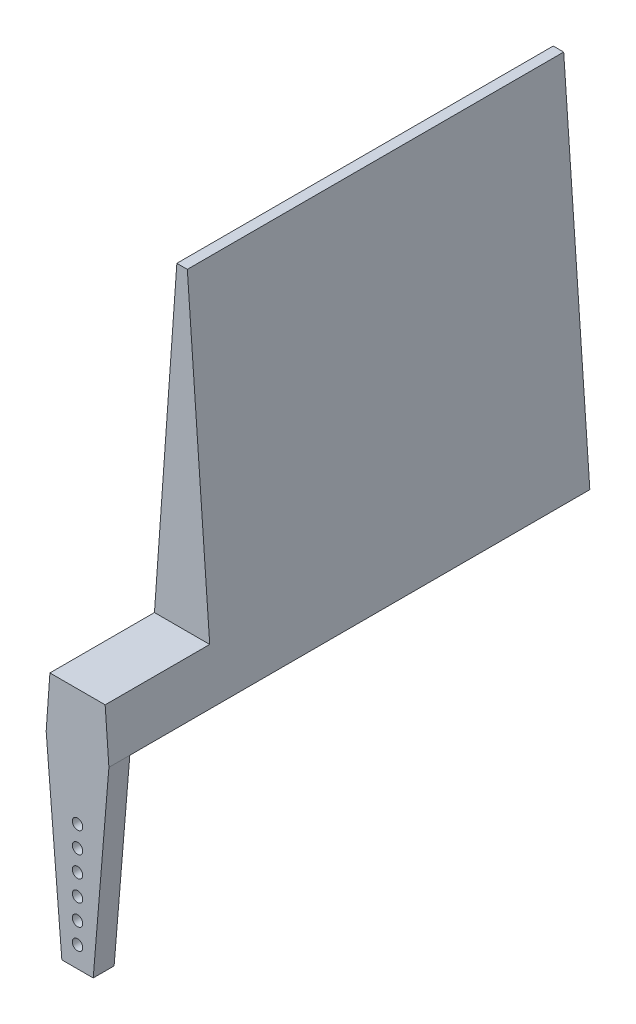
ISO-10303-21;
HEADER;
FILE_DESCRIPTION(('STEP AP214'),'2;1');
FILE_NAME('part.step','',(''),(''),'','','');
FILE_SCHEMA(('AUTOMOTIVE_DESIGN { 1 0 10303 214 1 1 1 1 }'));
ENDSEC;
DATA;
#1=APPLICATION_CONTEXT('core data for automotive mechanical design processes');
#2=APPLICATION_PROTOCOL_DEFINITION('international standard','automotive_design',2000,#1);
#3=PRODUCT_CONTEXT('',#1,'mechanical');
#4=PRODUCT('Part','Part','',(#3));
#5=PRODUCT_RELATED_PRODUCT_CATEGORY('part','',(#4));
#6=PRODUCT_DEFINITION_FORMATION('','',#4);
#7=PRODUCT_DEFINITION_CONTEXT('part definition',#1,'design');
#8=PRODUCT_DEFINITION('design','',#6,#7);
#9=PRODUCT_DEFINITION_SHAPE('','',#8);
#10=(LENGTH_UNIT() NAMED_UNIT(*) SI_UNIT(.MILLI.,.METRE.));
#11=(NAMED_UNIT(*) PLANE_ANGLE_UNIT() SI_UNIT($,.RADIAN.));
#12=(NAMED_UNIT(*) SI_UNIT($,.STERADIAN.) SOLID_ANGLE_UNIT());
#13=UNCERTAINTY_MEASURE_WITH_UNIT(LENGTH_MEASURE(1.E-05),#10,'distance_accuracy_value','');
#14=(GEOMETRIC_REPRESENTATION_CONTEXT(3) GLOBAL_UNCERTAINTY_ASSIGNED_CONTEXT((#13)) GLOBAL_UNIT_ASSIGNED_CONTEXT((#10,
#11,#12)) REPRESENTATION_CONTEXT('',''));
#15=CARTESIAN_POINT('',(0.,0.,0.));
#16=DIRECTION('',(0.,0.,1.));
#17=DIRECTION('',(1.,0.,0.));
#18=AXIS2_PLACEMENT_3D('',#15,#16,#17);
#19=CARTESIAN_POINT('',(60.5722359618717,20.7278633503816,-36.));
#20=DIRECTION('',(0.,-1.,0.));
#21=DIRECTION('',(0.,0.,-1.));
#22=AXIS2_PLACEMENT_3D('',#19,#20,#21);
#23=PLANE('',#22);
#24=DIRECTION('',(0.,0.,1.));
#25=VECTOR('',#24,1.);
#26=CARTESIAN_POINT('',(66.5722359618717,20.7278633503816,-36.));
#27=LINE('',#26,#25);
#28=CARTESIAN_POINT('',(66.5722359618717,20.7278633503816,-36.));
#29=VERTEX_POINT('',#28);
#30=CARTESIAN_POINT('',(66.5722359618717,20.7278633503816,8.));
#31=VERTEX_POINT('',#30);
#32=EDGE_CURVE('E45',#29,#31,#27,.T.);
#33=ORIENTED_EDGE('',*,*,#32,.T.);
#34=DIRECTION('',(-1.,0.,0.));
#35=VECTOR('',#34,1.);
#36=CARTESIAN_POINT('',(66.5722359618717,20.7278633503816,8.));
#37=LINE('',#36,#35);
#38=CARTESIAN_POINT('',(60.5722359618717,20.7278633503816,8.));
#39=VERTEX_POINT('',#38);
#40=EDGE_CURVE('E122',#31,#39,#37,.T.);
#41=ORIENTED_EDGE('',*,*,#40,.T.);
#42=DIRECTION('',(0.,0.,1.));
#43=VECTOR('',#42,1.);
#44=CARTESIAN_POINT('',(60.5722359618717,20.7278633503816,-36.));
#45=LINE('',#44,#43);
#46=CARTESIAN_POINT('',(60.5722359618717,20.7278633503816,-36.));
#47=VERTEX_POINT('',#46);
#48=EDGE_CURVE('E11',#47,#39,#45,.T.);
#49=ORIENTED_EDGE('',*,*,#48,.F.);
#50=DIRECTION('',(1.,0.,0.));
#51=VECTOR('',#50,1.);
#52=CARTESIAN_POINT('',(60.5722359618717,20.7278633503816,-36.));
#53=LINE('',#52,#51);
#54=EDGE_CURVE('E165',#47,#29,#53,.T.);
#55=ORIENTED_EDGE('',*,*,#54,.T.);
#56=EDGE_LOOP('',(#33,#41,#49,#55));
#57=FACE_BOUND('',#56,.T.);
#58=ADVANCED_FACE('F39',(#57),#23,.T.);
#59=CARTESIAN_POINT('',(0.,0.,0.));
#60=DIRECTION('',(0.,0.,-1.));
#61=DIRECTION('',(-1.,0.,0.));
#62=AXIS2_PLACEMENT_3D('',#59,#60,#61);
#63=PLANE('',#62);
#64=DIRECTION('',(-1.,0.,0.));
#65=VECTOR('',#64,1.);
#66=CARTESIAN_POINT('',(60.9293788190146,25.7278633503816,0.));
#67=LINE('',#66,#65);
#68=CARTESIAN_POINT('',(66.2150931047289,25.7278633503816,0.));
#69=VERTEX_POINT('',#68);
#70=CARTESIAN_POINT('',(60.9293788190146,25.7278633503816,0.));
#71=VERTEX_POINT('',#70);
#72=EDGE_CURVE('E64',#69,#71,#67,.T.);
#73=ORIENTED_EDGE('',*,*,#72,.F.);
#74=DIRECTION('',(-0.0712470499879097,0.997458699830735,0.));
#75=VECTOR('',#74,1.);
#76=CARTESIAN_POINT('',(64.0722359618717,55.7278633503816,0.));
#77=LINE('',#76,#75);
#78=CARTESIAN_POINT('',(64.0722359618717,55.7278633503816,0.));
#79=VERTEX_POINT('',#78);
#80=EDGE_CURVE('E161',#69,#79,#77,.T.);
#81=ORIENTED_EDGE('',*,*,#80,.T.);
#82=DIRECTION('',(-1.,0.,0.));
#83=VECTOR('',#82,1.);
#84=CARTESIAN_POINT('',(63.0722359618717,55.7278633503816,0.));
#85=LINE('',#84,#83);
#86=CARTESIAN_POINT('',(63.0722359618717,55.7278633503816,0.));
#87=VERTEX_POINT('',#86);
#88=EDGE_CURVE('E178',#79,#87,#85,.T.);
#89=ORIENTED_EDGE('',*,*,#88,.T.);
#90=DIRECTION('',(-0.0712470499879097,-0.997458699830735,0.));
#91=VECTOR('',#90,1.);
#92=CARTESIAN_POINT('',(63.0722359618717,55.7278633503816,0.));
#93=LINE('',#92,#91);
#94=EDGE_CURVE('E166',#87,#71,#93,.T.);
#95=ORIENTED_EDGE('',*,*,#94,.T.);
#96=EDGE_LOOP('',(#73,#81,#89,#95));
#97=FACE_BOUND('',#96,.T.);
#98=ADVANCED_FACE('F196',(#97),#63,.F.);
#99=CARTESIAN_POINT('',(63.0722359618717,55.7278633503816,-36.));
#100=DIRECTION('',(-0.997458699830735,0.0712470499879097,0.));
#101=DIRECTION('',(-0.0712470499879097,-0.997458699830735,0.));
#102=AXIS2_PLACEMENT_3D('',#99,#100,#101);
#103=PLANE('',#102);
#104=ORIENTED_EDGE('',*,*,#94,.F.);
#105=DIRECTION('',(0.,0.,1.));
#106=VECTOR('',#105,1.);
#107=CARTESIAN_POINT('',(63.0722359618717,55.7278633503816,-36.));
#108=LINE('',#107,#106);
#109=CARTESIAN_POINT('',(63.0722359618717,55.7278633503816,-36.));
#110=VERTEX_POINT('',#109);
#111=EDGE_CURVE('E50',#110,#87,#108,.T.);
#112=ORIENTED_EDGE('',*,*,#111,.F.);
#113=DIRECTION('',(-0.0712470499879097,-0.997458699830735,0.));
#114=VECTOR('',#113,1.);
#115=CARTESIAN_POINT('',(63.0722359618717,55.7278633503816,-36.));
#116=LINE('',#115,#114);
#117=EDGE_CURVE('E172',#110,#47,#116,.T.);
#118=ORIENTED_EDGE('',*,*,#117,.T.);
#119=ORIENTED_EDGE('',*,*,#48,.T.);
#120=DIRECTION('',(0.,0.,1.));
#121=VECTOR('',#120,1.);
#122=CARTESIAN_POINT('',(60.5722359618717,20.7278633503816,8.));
#123=LINE('',#122,#121);
#124=CARTESIAN_POINT('',(60.5722359618717,20.7278633503816,10.));
#125=VERTEX_POINT('',#124);
#126=EDGE_CURVE('E126',#39,#125,#123,.T.);
#127=ORIENTED_EDGE('',*,*,#126,.T.);
#128=DIRECTION('',(-0.0712470499879105,-0.997458699830735,0.));
#129=VECTOR('',#128,1.);
#130=CARTESIAN_POINT('',(60.5722359618717,20.7278633503816,10.));
#131=LINE('',#130,#129);
#132=CARTESIAN_POINT('',(60.9293788190146,25.7278633503816,10.));
#133=VERTEX_POINT('',#132);
#134=EDGE_CURVE('E152',#133,#125,#131,.T.);
#135=ORIENTED_EDGE('',*,*,#134,.F.);
#136=DIRECTION('',(0.,0.,-1.));
#137=VECTOR('',#136,1.);
#138=CARTESIAN_POINT('',(60.9293788190146,25.7278633503816,10.));
#139=LINE('',#138,#137);
#140=EDGE_CURVE('E159',#133,#71,#139,.T.);
#141=ORIENTED_EDGE('',*,*,#140,.T.);
#142=EDGE_LOOP('',(#104,#112,#118,#119,#127,#135,#141));
#143=FACE_BOUND('',#142,.T.);
#144=ADVANCED_FACE('F201',(#143),#103,.T.);
#145=CARTESIAN_POINT('',(63.0722359618717,55.7278633503816,-36.));
#146=DIRECTION('',(0.,1.,0.));
#147=DIRECTION('',(0.,0.,1.));
#148=AXIS2_PLACEMENT_3D('',#145,#146,#147);
#149=PLANE('',#148);
#150=ORIENTED_EDGE('',*,*,#88,.F.);
#151=DIRECTION('',(0.,0.,1.));
#152=VECTOR('',#151,1.);
#153=CARTESIAN_POINT('',(64.0722359618717,55.7278633503816,-36.));
#154=LINE('',#153,#152);
#155=CARTESIAN_POINT('',(64.0722359618717,55.7278633503816,-36.));
#156=VERTEX_POINT('',#155);
#157=EDGE_CURVE('E185',#156,#79,#154,.T.);
#158=ORIENTED_EDGE('',*,*,#157,.F.);
#159=DIRECTION('',(-1.,0.,0.));
#160=VECTOR('',#159,1.);
#161=CARTESIAN_POINT('',(63.0722359618717,55.7278633503816,-36.));
#162=LINE('',#161,#160);
#163=EDGE_CURVE('E171',#156,#110,#162,.T.);
#164=ORIENTED_EDGE('',*,*,#163,.T.);
#165=ORIENTED_EDGE('',*,*,#111,.T.);
#166=EDGE_LOOP('',(#150,#158,#164,#165));
#167=FACE_BOUND('',#166,.T.);
#168=ADVANCED_FACE('F197',(#167),#149,.T.);
#169=CARTESIAN_POINT('',(64.0722359618717,55.7278633503816,-36.));
#170=DIRECTION('',(0.997458699830735,0.0712470499879097,0.));
#171=DIRECTION('',(-0.0712470499879097,0.997458699830735,0.));
#172=AXIS2_PLACEMENT_3D('',#169,#170,#171);
#173=PLANE('',#172);
#174=ORIENTED_EDGE('',*,*,#80,.F.);
#175=DIRECTION('',(0.,0.,-1.));
#176=VECTOR('',#175,1.);
#177=CARTESIAN_POINT('',(66.2150931047289,25.7278633503816,10.));
#178=LINE('',#177,#176);
#179=CARTESIAN_POINT('',(66.2150931047289,25.7278633503816,10.));
#180=VERTEX_POINT('',#179);
#181=EDGE_CURVE('E157',#180,#69,#178,.T.);
#182=ORIENTED_EDGE('',*,*,#181,.F.);
#183=DIRECTION('',(-0.0712470499879105,0.997458699830735,0.));
#184=VECTOR('',#183,1.);
#185=CARTESIAN_POINT('',(66.2150931047289,25.7278633503816,10.));
#186=LINE('',#185,#184);
#187=CARTESIAN_POINT('',(66.5722359618717,20.7278633503816,10.));
#188=VERTEX_POINT('',#187);
#189=EDGE_CURVE('E146',#188,#180,#186,.T.);
#190=ORIENTED_EDGE('',*,*,#189,.F.);
#191=DIRECTION('',(0.,0.,1.));
#192=VECTOR('',#191,1.);
#193=CARTESIAN_POINT('',(66.5722359618717,20.7278633503816,8.));
#194=LINE('',#193,#192);
#195=EDGE_CURVE('E147',#31,#188,#194,.T.);
#196=ORIENTED_EDGE('',*,*,#195,.F.);
#197=ORIENTED_EDGE('',*,*,#32,.F.);
#198=DIRECTION('',(-0.0712470499879097,0.997458699830735,0.));
#199=VECTOR('',#198,1.);
#200=CARTESIAN_POINT('',(64.0722359618717,55.7278633503816,-36.));
#201=LINE('',#200,#199);
#202=EDGE_CURVE('E170',#29,#156,#201,.T.);
#203=ORIENTED_EDGE('',*,*,#202,.T.);
#204=ORIENTED_EDGE('',*,*,#157,.T.);
#205=EDGE_LOOP('',(#174,#182,#190,#196,#197,#203,#204));
#206=FACE_BOUND('',#205,.T.);
#207=ADVANCED_FACE('F192',(#206),#173,.T.);
#208=CARTESIAN_POINT('',(0.,0.,-36.));
#209=DIRECTION('',(0.,0.,-1.));
#210=DIRECTION('',(-1.,0.,0.));
#211=AXIS2_PLACEMENT_3D('',#208,#209,#210);
#212=PLANE('',#211);
#213=ORIENTED_EDGE('',*,*,#54,.F.);
#214=ORIENTED_EDGE('',*,*,#117,.F.);
#215=ORIENTED_EDGE('',*,*,#163,.F.);
#216=ORIENTED_EDGE('',*,*,#202,.F.);
#217=EDGE_LOOP('',(#213,#214,#215,#216));
#218=FACE_BOUND('',#217,.T.);
#219=ADVANCED_FACE('F193',(#218),#212,.T.);
#220=CARTESIAN_POINT('',(60.9293788190146,25.7278633503816,10.));
#221=DIRECTION('',(0.,-1.,0.));
#222=DIRECTION('',(0.,0.,-1.));
#223=AXIS2_PLACEMENT_3D('',#220,#221,#222);
#224=PLANE('',#223);
#225=ORIENTED_EDGE('',*,*,#72,.T.);
#226=ORIENTED_EDGE('',*,*,#140,.F.);
#227=DIRECTION('',(-1.,0.,0.));
#228=VECTOR('',#227,1.);
#229=CARTESIAN_POINT('',(60.9293788190146,25.7278633503816,10.));
#230=LINE('',#229,#228);
#231=EDGE_CURVE('E153',#180,#133,#230,.T.);
#232=ORIENTED_EDGE('',*,*,#231,.F.);
#233=ORIENTED_EDGE('',*,*,#181,.T.);
#234=EDGE_LOOP('',(#225,#226,#232,#233));
#235=FACE_BOUND('',#234,.T.);
#236=ADVANCED_FACE('F210',(#235),#224,.F.);
#237=CARTESIAN_POINT('',(0.,0.,10.));
#238=DIRECTION('',(0.,0.,-1.));
#239=DIRECTION('',(-1.,0.,0.));
#240=AXIS2_PLACEMENT_3D('',#237,#238,#239);
#241=PLANE('',#240);
#242=ORIENTED_EDGE('',*,*,#134,.T.);
#243=DIRECTION('',(0.0821390832087535,-0.996620876266209,0.));
#244=VECTOR('',#243,1.);
#245=CARTESIAN_POINT('',(60.5722359618717,20.7278633503816,10.));
#246=LINE('',#245,#244);
#247=CARTESIAN_POINT('',(62.0722359618717,2.52786335038159,10.));
#248=VERTEX_POINT('',#247);
#249=EDGE_CURVE('E142',#125,#248,#246,.T.);
#250=ORIENTED_EDGE('',*,*,#249,.T.);
#251=DIRECTION('',(1.,0.,0.));
#252=VECTOR('',#251,1.);
#253=CARTESIAN_POINT('',(62.0722359618717,2.52786335038159,10.));
#254=LINE('',#253,#252);
#255=CARTESIAN_POINT('',(65.0722359618717,2.52786335038159,10.));
#256=VERTEX_POINT('',#255);
#257=EDGE_CURVE('E120',#248,#256,#254,.T.);
#258=ORIENTED_EDGE('',*,*,#257,.T.);
#259=DIRECTION('',(0.0821390832087535,0.996620876266209,0.));
#260=VECTOR('',#259,1.);
#261=CARTESIAN_POINT('',(65.0722359618717,2.52786335038159,10.));
#262=LINE('',#261,#260);
#263=EDGE_CURVE('E133',#256,#188,#262,.T.);
#264=ORIENTED_EDGE('',*,*,#263,.T.);
#265=ORIENTED_EDGE('',*,*,#189,.T.);
#266=ORIENTED_EDGE('',*,*,#231,.T.);
#267=EDGE_LOOP('',(#242,#250,#258,#264,#265,#266));
#268=FACE_BOUND('',#267,.T.);
#269=CARTESIAN_POINT('',(63.5722359618717,6.52786335038159,10.));
#270=DIRECTION('',(0.,0.,1.));
#271=DIRECTION('',(-1.,0.,0.));
#272=AXIS2_PLACEMENT_3D('',#269,#270,#271);
#273=CIRCLE('',#272,0.500000000002423);
#274=CARTESIAN_POINT('',(63.0722359618693,6.52786335038159,10.));
#275=VERTEX_POINT('',#274);
#276=EDGE_CURVE('E341',#275,#275,#273,.T.);
#277=ORIENTED_EDGE('',*,*,#276,.F.);
#278=EDGE_LOOP('',(#277));
#279=FACE_BOUND('',#278,.T.);
#280=CARTESIAN_POINT('',(63.5722359618717,4.52786335038159,10.));
#281=DIRECTION('',(0.,0.,1.));
#282=DIRECTION('',(-1.,0.,0.));
#283=AXIS2_PLACEMENT_3D('',#280,#281,#282);
#284=CIRCLE('',#283,0.500000000002423);
#285=CARTESIAN_POINT('',(63.0722359618693,4.52786335038159,10.));
#286=VERTEX_POINT('',#285);
#287=EDGE_CURVE('E348',#286,#286,#284,.T.);
#288=ORIENTED_EDGE('',*,*,#287,.F.);
#289=EDGE_LOOP('',(#288));
#290=FACE_BOUND('',#289,.T.);
#291=CARTESIAN_POINT('',(63.5722359618717,8.52786335038159,10.));
#292=DIRECTION('',(0.,0.,1.));
#293=DIRECTION('',(-1.,0.,0.));
#294=AXIS2_PLACEMENT_3D('',#291,#292,#293);
#295=CIRCLE('',#294,0.500000000002423);
#296=CARTESIAN_POINT('',(63.0722359618693,8.52786335038159,10.));
#297=VERTEX_POINT('',#296);
#298=EDGE_CURVE('E351',#297,#297,#295,.T.);
#299=ORIENTED_EDGE('',*,*,#298,.F.);
#300=EDGE_LOOP('',(#299));
#301=FACE_BOUND('',#300,.T.);
#302=CARTESIAN_POINT('',(63.5722359618717,10.5278633503816,10.));
#303=DIRECTION('',(0.,0.,1.));
#304=DIRECTION('',(-1.,0.,0.));
#305=AXIS2_PLACEMENT_3D('',#302,#303,#304);
#306=CIRCLE('',#305,0.500000000002423);
#307=CARTESIAN_POINT('',(63.0722359618693,10.5278633503816,10.));
#308=VERTEX_POINT('',#307);
#309=EDGE_CURVE('E356',#308,#308,#306,.T.);
#310=ORIENTED_EDGE('',*,*,#309,.F.);
#311=EDGE_LOOP('',(#310));
#312=FACE_BOUND('',#311,.T.);
#313=CARTESIAN_POINT('',(63.5722359618717,12.5278633503816,10.));
#314=DIRECTION('',(0.,0.,1.));
#315=DIRECTION('',(-1.,0.,0.));
#316=AXIS2_PLACEMENT_3D('',#313,#314,#315);
#317=CIRCLE('',#316,0.500000000002423);
#318=CARTESIAN_POINT('',(63.0722359618693,12.5278633503816,10.));
#319=VERTEX_POINT('',#318);
#320=EDGE_CURVE('E364',#319,#319,#317,.T.);
#321=ORIENTED_EDGE('',*,*,#320,.F.);
#322=EDGE_LOOP('',(#321));
#323=FACE_BOUND('',#322,.T.);
#324=CARTESIAN_POINT('',(63.5722359618717,14.5278633503816,10.));
#325=DIRECTION('',(0.,0.,1.));
#326=DIRECTION('',(-1.,0.,0.));
#327=AXIS2_PLACEMENT_3D('',#324,#325,#326);
#328=CIRCLE('',#327,0.500000000002423);
#329=CARTESIAN_POINT('',(63.0722359618693,14.5278633503816,10.));
#330=VERTEX_POINT('',#329);
#331=EDGE_CURVE('E139',#330,#330,#328,.T.);
#332=ORIENTED_EDGE('',*,*,#331,.F.);
#333=EDGE_LOOP('',(#332));
#334=FACE_BOUND('',#333,.T.);
#335=ADVANCED_FACE('F208',(#268,#279,#290,#301,#312,#323,#334),#241,.F.);
#336=CARTESIAN_POINT('',(60.5722359618717,20.7278633503816,8.));
#337=DIRECTION('',(-0.996620876266209,-0.0821390832087535,0.));
#338=DIRECTION('',(0.0821390832087535,-0.996620876266209,0.));
#339=AXIS2_PLACEMENT_3D('',#336,#337,#338);
#340=PLANE('',#339);
#341=ORIENTED_EDGE('',*,*,#249,.F.);
#342=ORIENTED_EDGE('',*,*,#126,.F.);
#343=DIRECTION('',(0.0821390832087535,-0.996620876266209,0.));
#344=VECTOR('',#343,1.);
#345=CARTESIAN_POINT('',(60.5722359618717,20.7278633503816,8.));
#346=LINE('',#345,#344);
#347=CARTESIAN_POINT('',(62.0722359618717,2.52786335038159,8.));
#348=VERTEX_POINT('',#347);
#349=EDGE_CURVE('E54',#39,#348,#346,.T.);
#350=ORIENTED_EDGE('',*,*,#349,.T.);
#351=DIRECTION('',(0.,0.,1.));
#352=VECTOR('',#351,1.);
#353=CARTESIAN_POINT('',(62.0722359618717,2.52786335038159,8.));
#354=LINE('',#353,#352);
#355=EDGE_CURVE('E113',#348,#248,#354,.T.);
#356=ORIENTED_EDGE('',*,*,#355,.T.);
#357=EDGE_LOOP('',(#341,#342,#350,#356));
#358=FACE_BOUND('',#357,.T.);
#359=ADVANCED_FACE('F130',(#358),#340,.T.);
#360=CARTESIAN_POINT('',(65.0722359618717,2.52786335038159,8.));
#361=DIRECTION('',(0.996620876266209,-0.0821390832087535,0.));
#362=DIRECTION('',(0.0821390832087535,0.996620876266209,0.));
#363=AXIS2_PLACEMENT_3D('',#360,#361,#362);
#364=PLANE('',#363);
#365=ORIENTED_EDGE('',*,*,#263,.F.);
#366=DIRECTION('',(0.,0.,1.));
#367=VECTOR('',#366,1.);
#368=CARTESIAN_POINT('',(65.0722359618717,2.52786335038159,8.));
#369=LINE('',#368,#367);
#370=CARTESIAN_POINT('',(65.0722359618717,2.52786335038159,8.));
#371=VERTEX_POINT('',#370);
#372=EDGE_CURVE('E119',#371,#256,#369,.T.);
#373=ORIENTED_EDGE('',*,*,#372,.F.);
#374=DIRECTION('',(0.0821390832087535,0.996620876266209,0.));
#375=VECTOR('',#374,1.);
#376=CARTESIAN_POINT('',(65.0722359618717,2.52786335038159,8.));
#377=LINE('',#376,#375);
#378=EDGE_CURVE('E123',#371,#31,#377,.T.);
#379=ORIENTED_EDGE('',*,*,#378,.T.);
#380=ORIENTED_EDGE('',*,*,#195,.T.);
#381=EDGE_LOOP('',(#365,#373,#379,#380));
#382=FACE_BOUND('',#381,.T.);
#383=ADVANCED_FACE('F211',(#382),#364,.T.);
#384=CARTESIAN_POINT('',(62.0722359618717,2.52786335038159,8.));
#385=DIRECTION('',(0.,-1.,0.));
#386=DIRECTION('',(1.,0.,0.));
#387=AXIS2_PLACEMENT_3D('',#384,#385,#386);
#388=PLANE('',#387);
#389=ORIENTED_EDGE('',*,*,#257,.F.);
#390=ORIENTED_EDGE('',*,*,#355,.F.);
#391=DIRECTION('',(1.,0.,0.));
#392=VECTOR('',#391,1.);
#393=CARTESIAN_POINT('',(62.0722359618717,2.52786335038159,8.));
#394=LINE('',#393,#392);
#395=EDGE_CURVE('E114',#348,#371,#394,.T.);
#396=ORIENTED_EDGE('',*,*,#395,.T.);
#397=ORIENTED_EDGE('',*,*,#372,.T.);
#398=EDGE_LOOP('',(#389,#390,#396,#397));
#399=FACE_BOUND('',#398,.T.);
#400=ADVANCED_FACE('F112',(#399),#388,.T.);
#401=CARTESIAN_POINT('',(0.,0.,8.));
#402=DIRECTION('',(0.,0.,1.));
#403=DIRECTION('',(1.,0.,0.));
#404=AXIS2_PLACEMENT_3D('',#401,#402,#403);
#405=PLANE('',#404);
#406=CARTESIAN_POINT('',(63.5722359618717,6.52786335038159,8.));
#407=DIRECTION('',(0.,0.,1.));
#408=DIRECTION('',(-1.,0.,0.));
#409=AXIS2_PLACEMENT_3D('',#406,#407,#408);
#410=CIRCLE('',#409,0.500000000002423);
#411=CARTESIAN_POINT('',(63.0722359618693,6.52786335038159,8.));
#412=VERTEX_POINT('',#411);
#413=EDGE_CURVE('E342',#412,#412,#410,.T.);
#414=ORIENTED_EDGE('',*,*,#413,.T.);
#415=EDGE_LOOP('',(#414));
#416=FACE_BOUND('',#415,.T.);
#417=CARTESIAN_POINT('',(63.5722359618717,4.52786335038159,8.));
#418=DIRECTION('',(0.,0.,1.));
#419=DIRECTION('',(-1.,0.,0.));
#420=AXIS2_PLACEMENT_3D('',#417,#418,#419);
#421=CIRCLE('',#420,0.500000000002423);
#422=CARTESIAN_POINT('',(63.0722359618693,4.52786335038159,8.));
#423=VERTEX_POINT('',#422);
#424=EDGE_CURVE('E350',#423,#423,#421,.T.);
#425=ORIENTED_EDGE('',*,*,#424,.T.);
#426=EDGE_LOOP('',(#425));
#427=FACE_BOUND('',#426,.T.);
#428=CARTESIAN_POINT('',(63.5722359618717,8.52786335038159,8.));
#429=DIRECTION('',(0.,0.,1.));
#430=DIRECTION('',(-1.,0.,0.));
#431=AXIS2_PLACEMENT_3D('',#428,#429,#430);
#432=CIRCLE('',#431,0.500000000002423);
#433=CARTESIAN_POINT('',(63.0722359618693,8.52786335038159,8.));
#434=VERTEX_POINT('',#433);
#435=EDGE_CURVE('E352',#434,#434,#432,.T.);
#436=ORIENTED_EDGE('',*,*,#435,.T.);
#437=EDGE_LOOP('',(#436));
#438=FACE_BOUND('',#437,.T.);
#439=CARTESIAN_POINT('',(63.5722359618717,10.5278633503816,8.));
#440=DIRECTION('',(0.,0.,1.));
#441=DIRECTION('',(-1.,0.,0.));
#442=AXIS2_PLACEMENT_3D('',#439,#440,#441);
#443=CIRCLE('',#442,0.500000000002423);
#444=CARTESIAN_POINT('',(63.0722359618693,10.5278633503816,8.));
#445=VERTEX_POINT('',#444);
#446=EDGE_CURVE('E363',#445,#445,#443,.T.);
#447=ORIENTED_EDGE('',*,*,#446,.T.);
#448=EDGE_LOOP('',(#447));
#449=FACE_BOUND('',#448,.T.);
#450=CARTESIAN_POINT('',(63.5722359618717,12.5278633503816,8.));
#451=DIRECTION('',(0.,0.,1.));
#452=DIRECTION('',(-1.,0.,0.));
#453=AXIS2_PLACEMENT_3D('',#450,#451,#452);
#454=CIRCLE('',#453,0.500000000002423);
#455=CARTESIAN_POINT('',(63.0722359618693,12.5278633503816,8.));
#456=VERTEX_POINT('',#455);
#457=EDGE_CURVE('E370',#456,#456,#454,.T.);
#458=ORIENTED_EDGE('',*,*,#457,.T.);
#459=EDGE_LOOP('',(#458));
#460=FACE_BOUND('',#459,.T.);
#461=CARTESIAN_POINT('',(63.5722359618717,14.5278633503816,8.));
#462=DIRECTION('',(0.,0.,1.));
#463=DIRECTION('',(-1.,0.,0.));
#464=AXIS2_PLACEMENT_3D('',#461,#462,#463);
#465=CIRCLE('',#464,0.500000000002423);
#466=CARTESIAN_POINT('',(63.0722359618693,14.5278633503816,8.));
#467=VERTEX_POINT('',#466);
#468=EDGE_CURVE('E141',#467,#467,#465,.T.);
#469=ORIENTED_EDGE('',*,*,#468,.T.);
#470=EDGE_LOOP('',(#469));
#471=FACE_BOUND('',#470,.T.);
#472=ORIENTED_EDGE('',*,*,#349,.F.);
#473=ORIENTED_EDGE('',*,*,#40,.F.);
#474=ORIENTED_EDGE('',*,*,#378,.F.);
#475=ORIENTED_EDGE('',*,*,#395,.F.);
#476=EDGE_LOOP('',(#472,#473,#474,#475));
#477=FACE_BOUND('',#476,.T.);
#478=ADVANCED_FACE('F121',(#416,#427,#438,#449,#460,#471,#477),#405,.F.);
#479=CARTESIAN_POINT('',(63.5722359618717,14.5278633503816,8.));
#480=DIRECTION('',(0.,0.,1.));
#481=DIRECTION('',(1.,0.,0.));
#482=AXIS2_PLACEMENT_3D('',#479,#480,#481);
#483=CYLINDRICAL_SURFACE('',#482,0.500000000002423);
#484=ORIENTED_EDGE('',*,*,#468,.F.);
#485=EDGE_LOOP('',(#484));
#486=FACE_BOUND('',#485,.T.);
#487=ORIENTED_EDGE('',*,*,#331,.T.);
#488=EDGE_LOOP('',(#487));
#489=FACE_BOUND('',#488,.T.);
#490=ADVANCED_FACE('F277',(#486,#489),#483,.F.);
#491=CARTESIAN_POINT('',(63.5722359618717,12.5278633503816,8.));
#492=DIRECTION('',(0.,0.,1.));
#493=DIRECTION('',(1.,0.,0.));
#494=AXIS2_PLACEMENT_3D('',#491,#492,#493);
#495=CYLINDRICAL_SURFACE('',#494,0.500000000002423);
#496=ORIENTED_EDGE('',*,*,#457,.F.);
#497=EDGE_LOOP('',(#496));
#498=FACE_BOUND('',#497,.T.);
#499=ORIENTED_EDGE('',*,*,#320,.T.);
#500=EDGE_LOOP('',(#499));
#501=FACE_BOUND('',#500,.T.);
#502=ADVANCED_FACE('F281',(#498,#501),#495,.F.);
#503=CARTESIAN_POINT('',(63.5722359618717,10.5278633503816,8.));
#504=DIRECTION('',(0.,0.,1.));
#505=DIRECTION('',(1.,0.,0.));
#506=AXIS2_PLACEMENT_3D('',#503,#504,#505);
#507=CYLINDRICAL_SURFACE('',#506,0.500000000002423);
#508=ORIENTED_EDGE('',*,*,#446,.F.);
#509=EDGE_LOOP('',(#508));
#510=FACE_BOUND('',#509,.T.);
#511=ORIENTED_EDGE('',*,*,#309,.T.);
#512=EDGE_LOOP('',(#511));
#513=FACE_BOUND('',#512,.T.);
#514=ADVANCED_FACE('F294',(#510,#513),#507,.F.);
#515=CARTESIAN_POINT('',(63.5722359618717,8.52786335038159,8.));
#516=DIRECTION('',(0.,0.,1.));
#517=DIRECTION('',(1.,0.,0.));
#518=AXIS2_PLACEMENT_3D('',#515,#516,#517);
#519=CYLINDRICAL_SURFACE('',#518,0.500000000002423);
#520=ORIENTED_EDGE('',*,*,#435,.F.);
#521=EDGE_LOOP('',(#520));
#522=FACE_BOUND('',#521,.T.);
#523=ORIENTED_EDGE('',*,*,#298,.T.);
#524=EDGE_LOOP('',(#523));
#525=FACE_BOUND('',#524,.T.);
#526=ADVANCED_FACE('F304',(#522,#525),#519,.F.);
#527=CARTESIAN_POINT('',(63.5722359618717,4.52786335038159,8.));
#528=DIRECTION('',(0.,0.,1.));
#529=DIRECTION('',(1.,0.,0.));
#530=AXIS2_PLACEMENT_3D('',#527,#528,#529);
#531=CYLINDRICAL_SURFACE('',#530,0.500000000002423);
#532=ORIENTED_EDGE('',*,*,#424,.F.);
#533=EDGE_LOOP('',(#532));
#534=FACE_BOUND('',#533,.T.);
#535=ORIENTED_EDGE('',*,*,#287,.T.);
#536=EDGE_LOOP('',(#535));
#537=FACE_BOUND('',#536,.T.);
#538=ADVANCED_FACE('F314',(#534,#537),#531,.F.);
#539=CARTESIAN_POINT('',(63.5722359618717,6.52786335038159,8.));
#540=DIRECTION('',(0.,0.,1.));
#541=DIRECTION('',(1.,0.,0.));
#542=AXIS2_PLACEMENT_3D('',#539,#540,#541);
#543=CYLINDRICAL_SURFACE('',#542,0.500000000002423);
#544=ORIENTED_EDGE('',*,*,#413,.F.);
#545=EDGE_LOOP('',(#544));
#546=FACE_BOUND('',#545,.T.);
#547=ORIENTED_EDGE('',*,*,#276,.T.);
#548=EDGE_LOOP('',(#547));
#549=FACE_BOUND('',#548,.T.);
#550=ADVANCED_FACE('F323',(#546,#549),#543,.F.);
#551=CLOSED_SHELL('',(#58,#98,#144,#168,#207,#219,#236,#335,#359,#383,#400,#478,#490,#502,#514,
#526,#538,#550));
#552=MANIFOLD_SOLID_BREP('B2',#551);
#553=ADVANCED_BREP_SHAPE_REPRESENTATION('',(#18,#552),#14);
#554=SHAPE_DEFINITION_REPRESENTATION(#9,#553);
ENDSEC;
END-ISO-10303-21;
